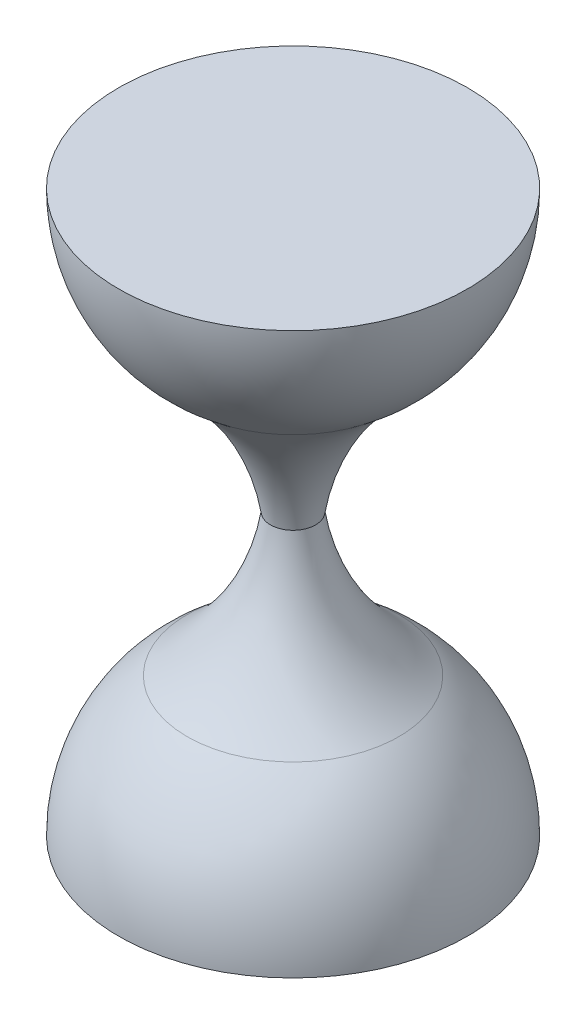
ISO-10303-21;
HEADER;
FILE_DESCRIPTION(('STEP AP214'),'2;1');
FILE_NAME('part.step','',(''),(''),'','','');
FILE_SCHEMA(('AUTOMOTIVE_DESIGN { 1 0 10303 214 1 1 1 1 }'));
ENDSEC;
DATA;
#1=APPLICATION_CONTEXT('core data for automotive mechanical design processes');
#2=APPLICATION_PROTOCOL_DEFINITION('international standard','automotive_design',2000,#1);
#3=PRODUCT_CONTEXT('',#1,'mechanical');
#4=PRODUCT('Part','Part','',(#3));
#5=PRODUCT_RELATED_PRODUCT_CATEGORY('part','',(#4));
#6=PRODUCT_DEFINITION_FORMATION('','',#4);
#7=PRODUCT_DEFINITION_CONTEXT('part definition',#1,'design');
#8=PRODUCT_DEFINITION('design','',#6,#7);
#9=PRODUCT_DEFINITION_SHAPE('','',#8);
#10=(LENGTH_UNIT() NAMED_UNIT(*) SI_UNIT(.MILLI.,.METRE.));
#11=(NAMED_UNIT(*) PLANE_ANGLE_UNIT() SI_UNIT($,.RADIAN.));
#12=(NAMED_UNIT(*) SI_UNIT($,.STERADIAN.) SOLID_ANGLE_UNIT());
#13=UNCERTAINTY_MEASURE_WITH_UNIT(LENGTH_MEASURE(1.E-05),#10,'distance_accuracy_value','');
#14=(GEOMETRIC_REPRESENTATION_CONTEXT(3) GLOBAL_UNCERTAINTY_ASSIGNED_CONTEXT((#13)) GLOBAL_UNIT_ASSIGNED_CONTEXT((#10,
#11,#12)) REPRESENTATION_CONTEXT('',''));
#15=CARTESIAN_POINT('',(0.,0.,0.));
#16=DIRECTION('',(0.,0.,1.));
#17=DIRECTION('',(1.,0.,0.));
#18=AXIS2_PLACEMENT_3D('',#15,#16,#17);
#19=CARTESIAN_POINT('',(0.,57.15,0.));
#20=DIRECTION('',(0.,1.,0.));
#21=DIRECTION('',(0.,0.,1.));
#22=AXIS2_PLACEMENT_3D('',#19,#20,#21);
#23=PLANE('',#22);
#24=CARTESIAN_POINT('',(0.,57.15,0.));
#25=DIRECTION('',(0.,-1.,0.));
#26=DIRECTION('',(0.,0.,-1.));
#27=AXIS2_PLACEMENT_3D('',#24,#25,#26);
#28=CIRCLE('',#27,35.56);
#29=CARTESIAN_POINT('',(0.,57.15,-35.56));
#30=VERTEX_POINT('',#29);
#31=EDGE_CURVE('E10',#30,#30,#28,.T.);
#32=ORIENTED_EDGE('',*,*,#31,.F.);
#33=EDGE_LOOP('',(#32));
#34=FACE_BOUND('',#33,.T.);
#35=ADVANCED_FACE('F32',(#34),#23,.T.);
#36=CARTESIAN_POINT('',(0.,57.15,0.));
#37=DIRECTION('',(0.,-1.,0.));
#38=DIRECTION('',(1.,0.,0.));
#39=AXIS2_PLACEMENT_3D('',#36,#37,#38);
#40=SPHERICAL_SURFACE('',#39,35.56);
#41=ORIENTED_EDGE('',*,*,#31,.T.);
#42=EDGE_LOOP('',(#41));
#43=FACE_BOUND('',#42,.T.);
#44=CARTESIAN_POINT('',(0.,28.891498977149,0.));
#45=DIRECTION('',(0.,-1.,0.));
#46=DIRECTION('',(0.,0.,-1.));
#47=AXIS2_PLACEMENT_3D('',#44,#45,#46);
#48=CIRCLE('',#47,21.5863549480112);
#49=CARTESIAN_POINT('',(0.,28.891498977149,-21.5863549480112));
#50=VERTEX_POINT('',#49);
#51=EDGE_CURVE('E38',#50,#50,#48,.T.);
#52=ORIENTED_EDGE('',*,*,#51,.F.);
#53=EDGE_LOOP('',(#52));
#54=FACE_BOUND('',#53,.T.);
#55=ADVANCED_FACE('F66',(#43,#54),#40,.T.);
#56=CARTESIAN_POINT('',(0.,-6.4316273014148,0.));
#57=DIRECTION('',(0.,-1.,0.));
#58=DIRECTION('',(0.,0.,-1.));
#59=AXIS2_PLACEMENT_3D('',#56,#57,#58);
#60=TOROIDAL_SURFACE('',#59,48.5692986330252,44.45);
#61=ORIENTED_EDGE('',*,*,#51,.T.);
#62=EDGE_LOOP('',(#61));
#63=FACE_BOUND('',#62,.T.);
#64=CARTESIAN_POINT('',(0.,0.,0.));
#65=DIRECTION('',(0.,-1.,0.));
#66=DIRECTION('',(0.,0.,-1.));
#67=AXIS2_PLACEMENT_3D('',#64,#65,#66);
#68=CIRCLE('',#67,4.58706733155875);
#69=CARTESIAN_POINT('',(0.,0.,-4.58706733155875));
#70=VERTEX_POINT('',#69);
#71=EDGE_CURVE('E42',#70,#70,#68,.T.);
#72=ORIENTED_EDGE('',*,*,#71,.F.);
#73=EDGE_LOOP('',(#72));
#74=FACE_BOUND('',#73,.T.);
#75=ADVANCED_FACE('F63',(#63,#74),#60,.F.);
#76=CARTESIAN_POINT('',(0.,-57.15,0.));
#77=DIRECTION('',(0.,-1.,0.));
#78=DIRECTION('',(0.,0.,1.));
#79=AXIS2_PLACEMENT_3D('',#76,#77,#78);
#80=PLANE('',#79);
#81=CARTESIAN_POINT('',(0.,-57.15,0.));
#82=DIRECTION('',(0.,-1.,0.));
#83=DIRECTION('',(0.,0.,-1.));
#84=AXIS2_PLACEMENT_3D('',#81,#82,#83);
#85=CIRCLE('',#84,35.56);
#86=CARTESIAN_POINT('',(0.,-57.15,-35.56));
#87=VERTEX_POINT('',#86);
#88=EDGE_CURVE('E46',#87,#87,#85,.T.);
#89=ORIENTED_EDGE('',*,*,#88,.T.);
#90=EDGE_LOOP('',(#89));
#91=FACE_BOUND('',#90,.T.);
#92=ADVANCED_FACE('F65',(#91),#80,.T.);
#93=CARTESIAN_POINT('',(0.,-57.15,0.));
#94=DIRECTION('',(0.,1.,0.));
#95=DIRECTION('',(1.,0.,0.));
#96=AXIS2_PLACEMENT_3D('',#93,#94,#95);
#97=SPHERICAL_SURFACE('',#96,35.56);
#98=ORIENTED_EDGE('',*,*,#88,.F.);
#99=EDGE_LOOP('',(#98));
#100=FACE_BOUND('',#99,.T.);
#101=CARTESIAN_POINT('',(0.,-28.891498977149,0.));
#102=DIRECTION('',(0.,-1.,0.));
#103=DIRECTION('',(0.,0.,-1.));
#104=AXIS2_PLACEMENT_3D('',#101,#102,#103);
#105=CIRCLE('',#104,21.5863549480112);
#106=CARTESIAN_POINT('',(0.,-28.891498977149,-21.5863549480112));
#107=VERTEX_POINT('',#106);
#108=EDGE_CURVE('E51',#107,#107,#105,.T.);
#109=ORIENTED_EDGE('',*,*,#108,.T.);
#110=EDGE_LOOP('',(#109));
#111=FACE_BOUND('',#110,.T.);
#112=ADVANCED_FACE('F55',(#100,#111),#97,.T.);
#113=CARTESIAN_POINT('',(0.,6.4316273014148,0.));
#114=DIRECTION('',(0.,1.,0.));
#115=DIRECTION('',(0.,0.,-1.));
#116=AXIS2_PLACEMENT_3D('',#113,#114,#115);
#117=TOROIDAL_SURFACE('',#116,48.5692986330252,44.45);
#118=ORIENTED_EDGE('',*,*,#108,.F.);
#119=EDGE_LOOP('',(#118));
#120=FACE_BOUND('',#119,.T.);
#121=ORIENTED_EDGE('',*,*,#71,.T.);
#122=EDGE_LOOP('',(#121));
#123=FACE_BOUND('',#122,.T.);
#124=ADVANCED_FACE('F57',(#120,#123),#117,.F.);
#125=CLOSED_SHELL('',(#35,#55,#75,#92,#112,#124));
#126=MANIFOLD_SOLID_BREP('B2',#125);
#127=ADVANCED_BREP_SHAPE_REPRESENTATION('',(#18,#126),#14);
#128=SHAPE_DEFINITION_REPRESENTATION(#9,#127);
ENDSEC;
END-ISO-10303-21;
